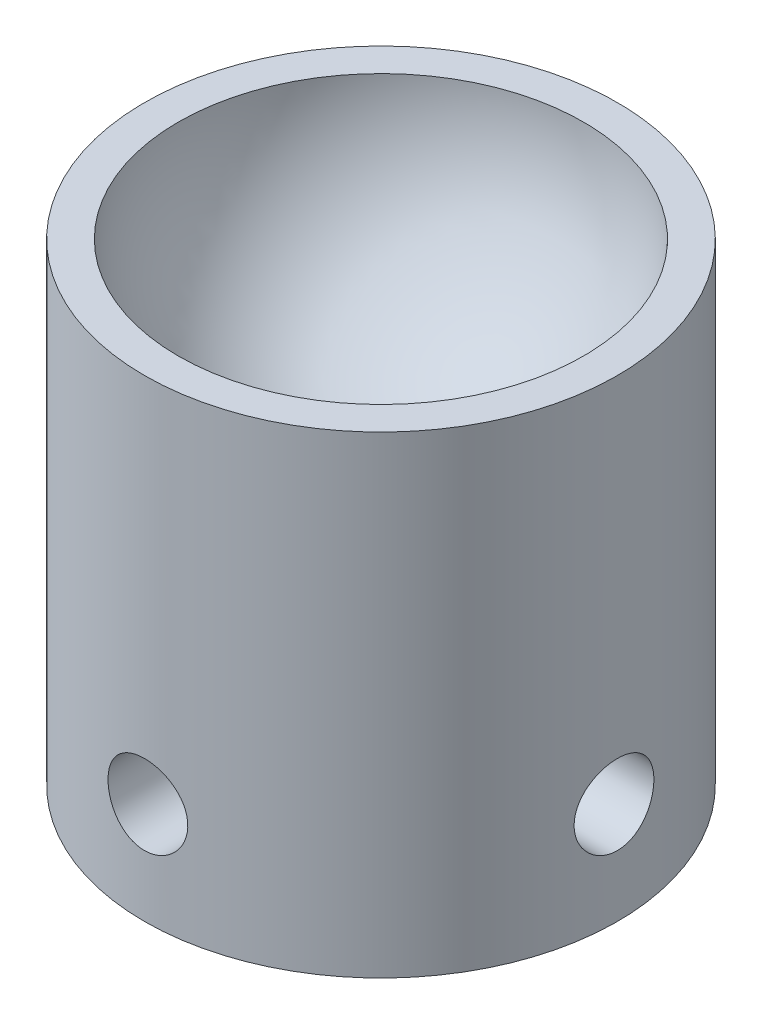
ISO-10303-21;
HEADER;
FILE_DESCRIPTION(('STEP AP214'),'2;1');
FILE_NAME('part.step','',(''),(''),'','','');
FILE_SCHEMA(('AUTOMOTIVE_DESIGN { 1 0 10303 214 1 1 1 1 }'));
ENDSEC;
DATA;
#1=APPLICATION_CONTEXT('core data for automotive mechanical design processes');
#2=APPLICATION_PROTOCOL_DEFINITION('international standard','automotive_design',2000,#1);
#3=PRODUCT_CONTEXT('',#1,'mechanical');
#4=PRODUCT('Part','Part','',(#3));
#5=PRODUCT_RELATED_PRODUCT_CATEGORY('part','',(#4));
#6=PRODUCT_DEFINITION_FORMATION('','',#4);
#7=PRODUCT_DEFINITION_CONTEXT('part definition',#1,'design');
#8=PRODUCT_DEFINITION('design','',#6,#7);
#9=PRODUCT_DEFINITION_SHAPE('','',#8);
#10=(LENGTH_UNIT() NAMED_UNIT(*) SI_UNIT(.MILLI.,.METRE.));
#11=(NAMED_UNIT(*) PLANE_ANGLE_UNIT() SI_UNIT($,.RADIAN.));
#12=(NAMED_UNIT(*) SI_UNIT($,.STERADIAN.) SOLID_ANGLE_UNIT());
#13=UNCERTAINTY_MEASURE_WITH_UNIT(LENGTH_MEASURE(1.E-05),#10,'distance_accuracy_value','');
#14=(GEOMETRIC_REPRESENTATION_CONTEXT(3) GLOBAL_UNCERTAINTY_ASSIGNED_CONTEXT((#13)) GLOBAL_UNIT_ASSIGNED_CONTEXT((#10,
#11,#12)) REPRESENTATION_CONTEXT('',''));
#15=CARTESIAN_POINT('',(0.,0.,0.));
#16=DIRECTION('',(0.,0.,1.));
#17=DIRECTION('',(1.,0.,0.));
#18=AXIS2_PLACEMENT_3D('',#15,#16,#17);
#19=CARTESIAN_POINT('',(0.,17.78,0.));
#20=DIRECTION('',(0.,-1.,0.));
#21=DIRECTION('',(0.,0.,-1.));
#22=AXIS2_PLACEMENT_3D('',#19,#20,#21);
#23=CYLINDRICAL_SURFACE('',#22,8.89);
#24=CARTESIAN_POINT('',(0.,17.78,0.));
#25=DIRECTION('',(0.,1.,0.));
#26=DIRECTION('',(0.,0.,1.));
#27=AXIS2_PLACEMENT_3D('',#24,#25,#26);
#28=CIRCLE('',#27,8.89);
#29=CARTESIAN_POINT('',(0.,17.78,8.89));
#30=VERTEX_POINT('',#29);
#31=EDGE_CURVE('E106',#30,#30,#28,.T.);
#32=ORIENTED_EDGE('',*,*,#31,.F.);
#33=EDGE_LOOP('',(#32));
#34=FACE_BOUND('',#33,.T.);
#35=CARTESIAN_POINT('',(0.,0.,0.));
#36=DIRECTION('',(0.,1.,0.));
#37=DIRECTION('',(0.,0.,1.));
#38=AXIS2_PLACEMENT_3D('',#35,#36,#37);
#39=CIRCLE('',#38,8.89);
#40=CARTESIAN_POINT('',(0.,0.,8.89));
#41=VERTEX_POINT('',#40);
#42=EDGE_CURVE('E109',#41,#41,#39,.T.);
#43=ORIENTED_EDGE('',*,*,#42,.T.);
#44=EDGE_LOOP('',(#43));
#45=FACE_BOUND('',#44,.T.);
#46=CARTESIAN_POINT('',(0.,5.31,-8.89));
#47=CARTESIAN_POINT('',(0.083619244032744,5.309996660814,-8.88999855737428));
#48=CARTESIAN_POINT('',(0.167283743570266,5.30298420109848,-8.88880793860139));
#49=CARTESIAN_POINT('',(0.332265171174126,5.27513190542198,-8.88417298508674));
#50=CARTESIAN_POINT('',(0.413579886449196,5.25427945246782,-8.88072659394836));
#51=CARTESIAN_POINT('',(0.571451022503896,5.19939556703437,-8.87196655693298));
#52=CARTESIAN_POINT('',(0.64801131349816,5.16537502131018,-8.86665445387327));
#53=CARTESIAN_POINT('',(0.794327496441052,5.085149404927,-8.85474669715955));
#54=CARTESIAN_POINT('',(0.864084143844678,5.03894568916334,-8.84815118625522));
#55=CARTESIAN_POINT('',(0.995505184062018,4.9351843108722,-8.83433528998376));
#56=CARTESIAN_POINT('',(1.05709332372455,4.87753071969983,-8.8271099361815));
#57=CARTESIAN_POINT('',(1.16977031476655,4.75271263264269,-8.8128866154523));
#58=CARTESIAN_POINT('',(1.22085849516851,4.68554752940795,-8.805888663081));
#59=CARTESIAN_POINT('',(1.31139204077857,4.54308775979755,-8.79286434398706));
#60=CARTESIAN_POINT('',(1.35076179862173,4.4677444066863,-8.78684439583679));
#61=CARTESIAN_POINT('',(1.41625739067095,4.31139527698634,-8.776526716091));
#62=CARTESIAN_POINT('',(1.4423841423903,4.2303898931219,-8.77222886518799));
#63=CARTESIAN_POINT('',(1.48041140584547,4.06582517931028,-8.76589150572812));
#64=CARTESIAN_POINT('',(1.4924436910227,3.98229711962522,-8.7638310921753));
#65=CARTESIAN_POINT('',(1.50234907598311,3.81438418338856,-8.76213867564258));
#66=CARTESIAN_POINT('',(1.50022320273959,3.72999936942564,-8.76250649652874));
#67=CARTESIAN_POINT('',(1.48197990479015,3.56371027791512,-8.76560990836582));
#68=CARTESIAN_POINT('',(1.46601067813342,3.48178920551851,-8.7683204190731));
#69=CARTESIAN_POINT('',(1.42076663144816,3.32180601440081,-8.77576453216942));
#70=CARTESIAN_POINT('',(1.39149134471982,3.24374403114078,-8.78049820551898));
#71=CARTESIAN_POINT('',(1.32031644649172,3.09325219840059,-8.79148228814132));
#72=CARTESIAN_POINT('',(1.27835545561975,3.02085193634523,-8.79774004235042));
#73=CARTESIAN_POINT('',(1.18304383024955,2.88406393868544,-8.81106211903501));
#74=CARTESIAN_POINT('',(1.12969225412714,2.8196768662034,-8.81812650817002));
#75=CARTESIAN_POINT('',(1.01230725012186,2.69988526818757,-8.83237599103691));
#76=CARTESIAN_POINT('',(0.948146706768969,2.64460527547387,-8.83956147791722));
#77=CARTESIAN_POINT('',(0.811394532355467,2.54557690670068,-8.85316060293243));
#78=CARTESIAN_POINT('',(0.73880284443681,2.50182860841528,-8.8595742358615));
#79=CARTESIAN_POINT('',(0.587130697781295,2.42709349497462,-8.870916457678));
#80=CARTESIAN_POINT('',(0.508044624643937,2.39611786408165,-8.8758437440515));
#81=CARTESIAN_POINT('',(0.345690856821238,2.34792390813881,-8.88364768250388));
#82=CARTESIAN_POINT('',(0.262423521421593,2.33070440320118,-8.886524510452));
#83=CARTESIAN_POINT('',(0.0951440549776342,2.31068074124361,-8.8898796947842));
#84=CARTESIAN_POINT('',(0.0111529347669649,2.30770565747931,-8.89038648879863));
#85=CARTESIAN_POINT('',(-0.156127544604831,2.31579932958637,-8.88902245420448));
#86=CARTESIAN_POINT('',(-0.239416931332953,2.32686753116546,-8.8871517194376));
#87=CARTESIAN_POINT('',(-0.402400369277261,2.36259142485057,-8.88126044230778));
#88=CARTESIAN_POINT('',(-0.482113534253656,2.38716231873531,-8.87725332129598));
#89=CARTESIAN_POINT('',(-0.636289133977939,2.4491035934227,-8.8675367725212));
#90=CARTESIAN_POINT('',(-0.710751267506555,2.48647470777596,-8.86182724719984));
#91=CARTESIAN_POINT('',(-0.853052327826102,2.57334582984733,-8.84926867727024));
#92=CARTESIAN_POINT('',(-0.920825322959676,2.62295238950411,-8.84240980154875));
#93=CARTESIAN_POINT('',(-1.047145872048,2.73273990707588,-8.82834257007869));
#94=CARTESIAN_POINT('',(-1.1056927375376,2.79292165341625,-8.82113418830197));
#95=CARTESIAN_POINT('',(-1.21253418915256,2.92291850843172,-8.80708819525932));
#96=CARTESIAN_POINT('',(-1.26071317647472,2.99282922045797,-8.80025533987522));
#97=CARTESIAN_POINT('',(-1.34464340060142,3.1398520153437,-8.7878234953174));
#98=CARTESIAN_POINT('',(-1.38039503840013,3.21696386574166,-8.78222446633384));
#99=CARTESIAN_POINT('',(-1.43828365517868,3.37587959489646,-8.77293005839471));
#100=CARTESIAN_POINT('',(-1.46047774375017,3.457662182658,-8.76922670497139));
#101=CARTESIAN_POINT('',(-1.49080065625236,3.62386237135786,-8.76412311254959));
#102=CARTESIAN_POINT('',(-1.49893073648699,3.70827973625202,-8.7627226678384));
#103=CARTESIAN_POINT('',(-1.50085914849675,3.87619852435982,-8.76239247215645));
#104=CARTESIAN_POINT('',(-1.49483947158132,3.95969785152656,-8.76343134696592));
#105=CARTESIAN_POINT('',(-1.46903323284326,4.12447732227122,-8.76779389847881));
#106=CARTESIAN_POINT('',(-1.44924671887362,4.20575747356188,-8.77111756724038));
#107=CARTESIAN_POINT('',(-1.39653887064636,4.36371837482701,-8.77966316734885));
#108=CARTESIAN_POINT('',(-1.36363358724359,4.44040461406675,-8.78488277831329));
#109=CARTESIAN_POINT('',(-1.28564106040869,4.58719754614013,-8.79663433056243));
#110=CARTESIAN_POINT('',(-1.24055318815746,4.65730389909322,-8.80316633958368));
#111=CARTESIAN_POINT('',(-1.13882742811584,4.78986574325301,-8.81690596700675));
#112=CARTESIAN_POINT('',(-1.08205578264398,4.85221785475052,-8.82412083379442));
#113=CARTESIAN_POINT('',(-0.958855792369681,4.9665727089643,-8.83835577452218));
#114=CARTESIAN_POINT('',(-0.892425223562485,5.01857306159704,-8.84537580315548));
#115=CARTESIAN_POINT('',(-0.751232350694191,5.11108630927995,-8.85848789847051));
#116=CARTESIAN_POINT('',(-0.676414271019465,5.15151507324093,-8.8645730270461));
#117=CARTESIAN_POINT('',(-0.520975819888329,5.21916793136975,-8.87506217271175));
#118=CARTESIAN_POINT('',(-0.4403612879639,5.24640510691241,-8.87946785429012));
#119=CARTESIAN_POINT('',(-0.299533614201586,5.28102536514075,-8.8851461806493));
#120=CARTESIAN_POINT('',(-0.240169889187229,5.29187334363987,-8.88695658268774));
#121=CARTESIAN_POINT('',(-0.120545272625734,5.30636180020692,-8.8893840017));
#122=CARTESIAN_POINT('',(-0.0602843971649691,5.31000240735033,-8.89000104004554));
#123=CARTESIAN_POINT('',(0.,5.31,-8.89));
#124=B_SPLINE_CURVE_WITH_KNOTS('',3,(#46,#47,#48,#49,#50,#51,#52,#53,#54,#55,#56,#57,#58,#59,
#60,#61,#62,#63,#64,#65,#66,#67,#68,#69,#70,#71,#72,#73,#74,#75,#76,#77,#78,#79,#80,#81,#82,#83,
#84,#85,#86,#87,#88,#89,#90,#91,#92,#93,#94,#95,#96,#97,#98,#99,#100,#101,#102,#103,#104,#105,
#106,#107,#108,#109,#110,#111,#112,#113,#114,#115,#116,#117,#118,#119,#120,#121,#122,#123),
.UNSPECIFIED.,.T.,.F.,(4,2,2,2,2,2,2,2,2,2,2,2,2,2,2,2,2,2,2,2,2,2,2,2,2,2,2,2,2,2,2,2,2,2,2,2,
2,2,4),(0.,0.250637365237149,0.501503534158908,0.752162740308566,1.00279408229381,
1.25562127889169,1.50846462685281,1.76290561943946,2.01732898121687,2.26935418077738,
2.52136109968829,2.7707030516303,3.02005374972436,3.2706307750932,3.52122852290988,
3.77501050194396,4.02879419253529,4.28279963685146,4.53678329232225,4.78771148575765,
5.03862977529751,5.28798998895488,5.53736449525282,5.78899249292869,6.04063925851329,
6.29496106115612,6.54927465681731,6.80250946291639,7.05572164699313,7.30569492097127,
7.55566732605638,7.8053348231359,8.05501520956846,8.30773114672437,8.56050536512957,
8.81507322194132,9.06938811825433,9.25008567473258,9.43077999510244),.UNSPECIFIED.);
#125=CARTESIAN_POINT('',(0.,5.31,-8.89));
#126=VERTEX_POINT('',#125);
#127=EDGE_CURVE('E72',#126,#126,#124,.T.);
#128=ORIENTED_EDGE('',*,*,#127,.F.);
#129=EDGE_LOOP('',(#128));
#130=FACE_BOUND('',#129,.T.);
#131=CARTESIAN_POINT('',(0.,2.31,8.89));
#132=CARTESIAN_POINT('',(0.083619244032744,2.310003339186,8.88999855737428));
#133=CARTESIAN_POINT('',(0.167283743570266,2.31701579890152,8.88880793860139));
#134=CARTESIAN_POINT('',(0.332265171174126,2.34486809457802,8.88417298508674));
#135=CARTESIAN_POINT('',(0.413579886449196,2.36572054753218,8.88072659394836));
#136=CARTESIAN_POINT('',(0.571451022503896,2.42060443296563,8.87196655693298));
#137=CARTESIAN_POINT('',(0.64801131349816,2.45462497868982,8.86665445387327));
#138=CARTESIAN_POINT('',(0.794327496441052,2.534850595073,8.85474669715955));
#139=CARTESIAN_POINT('',(0.864084143844678,2.58105431083666,8.84815118625522));
#140=CARTESIAN_POINT('',(0.995505184062018,2.6848156891278,8.83433528998376));
#141=CARTESIAN_POINT('',(1.05709332372455,2.74246928030017,8.8271099361815));
#142=CARTESIAN_POINT('',(1.16977031476655,2.86728736735731,8.8128866154523));
#143=CARTESIAN_POINT('',(1.22085849516851,2.93445247059205,8.805888663081));
#144=CARTESIAN_POINT('',(1.31139204077857,3.07691224020245,8.79286434398706));
#145=CARTESIAN_POINT('',(1.35076179862173,3.1522555933137,8.78684439583679));
#146=CARTESIAN_POINT('',(1.41625739067095,3.30860472301366,8.776526716091));
#147=CARTESIAN_POINT('',(1.4423841423903,3.3896101068781,8.77222886518799));
#148=CARTESIAN_POINT('',(1.48041140584547,3.55417482068972,8.76589150572812));
#149=CARTESIAN_POINT('',(1.4924436910227,3.63770288037478,8.7638310921753));
#150=CARTESIAN_POINT('',(1.50234907598311,3.80561581661144,8.76213867564258));
#151=CARTESIAN_POINT('',(1.50022320273959,3.89000063057436,8.76250649652874));
#152=CARTESIAN_POINT('',(1.48197990479015,4.05628972208488,8.76560990836582));
#153=CARTESIAN_POINT('',(1.46601067813342,4.13821079448149,8.7683204190731));
#154=CARTESIAN_POINT('',(1.42076663144816,4.29819398559919,8.77576453216942));
#155=CARTESIAN_POINT('',(1.39149134471982,4.37625596885922,8.78049820551898));
#156=CARTESIAN_POINT('',(1.32031644649172,4.52674780159941,8.79148228814132));
#157=CARTESIAN_POINT('',(1.27835545561975,4.59914806365477,8.79774004235042));
#158=CARTESIAN_POINT('',(1.18304383024955,4.73593606131455,8.81106211903501));
#159=CARTESIAN_POINT('',(1.12969225412714,4.80032313379659,8.81812650817002));
#160=CARTESIAN_POINT('',(1.01230725012186,4.92011473181243,8.83237599103691));
#161=CARTESIAN_POINT('',(0.948146706768968,4.97539472452613,8.83956147791722));
#162=CARTESIAN_POINT('',(0.811394532355466,5.07442309329932,8.85316060293243));
#163=CARTESIAN_POINT('',(0.738802844436809,5.11817139158472,8.8595742358615));
#164=CARTESIAN_POINT('',(0.587130697781294,5.19290650502538,8.870916457678));
#165=CARTESIAN_POINT('',(0.508044624643935,5.22388213591834,8.8758437440515));
#166=CARTESIAN_POINT('',(0.345690856821237,5.27207609186119,8.88364768250388));
#167=CARTESIAN_POINT('',(0.262423521421592,5.28929559679882,8.886524510452));
#168=CARTESIAN_POINT('',(0.0951440549776333,5.30931925875639,8.8898796947842));
#169=CARTESIAN_POINT('',(0.0111529347669643,5.31229434252069,8.89038648879863));
#170=CARTESIAN_POINT('',(-0.156127544604832,5.30420067041363,8.88902245420448));
#171=CARTESIAN_POINT('',(-0.239416931332954,5.29313246883454,8.8871517194376));
#172=CARTESIAN_POINT('',(-0.402400369277262,5.25740857514942,8.88126044230778));
#173=CARTESIAN_POINT('',(-0.482113534253657,5.23283768126469,8.87725332129598));
#174=CARTESIAN_POINT('',(-0.63628913397794,5.1708964065773,8.8675367725212));
#175=CARTESIAN_POINT('',(-0.710751267506555,5.13352529222404,8.86182724719984));
#176=CARTESIAN_POINT('',(-0.853052327826103,5.04665417015267,8.84926867727024));
#177=CARTESIAN_POINT('',(-0.920825322959677,4.99704761049589,8.84240980154875));
#178=CARTESIAN_POINT('',(-1.047145872048,4.88726009292412,8.82834257007869));
#179=CARTESIAN_POINT('',(-1.1056927375376,4.82707834658375,8.82113418830197));
#180=CARTESIAN_POINT('',(-1.21253418915256,4.69708149156828,8.80708819525932));
#181=CARTESIAN_POINT('',(-1.26071317647472,4.62717077954203,8.80025533987522));
#182=CARTESIAN_POINT('',(-1.34464340060142,4.4801479846563,8.7878234953174));
#183=CARTESIAN_POINT('',(-1.38039503840013,4.40303613425834,8.78222446633384));
#184=CARTESIAN_POINT('',(-1.43828365517868,4.24412040510353,8.77293005839471));
#185=CARTESIAN_POINT('',(-1.46047774375017,4.162337817342,8.76922670497139));
#186=CARTESIAN_POINT('',(-1.49080065625236,3.99613762864213,8.76412311254959));
#187=CARTESIAN_POINT('',(-1.49893073648699,3.91172026374798,8.7627226678384));
#188=CARTESIAN_POINT('',(-1.50085914849675,3.74380147564018,8.76239247215645));
#189=CARTESIAN_POINT('',(-1.49483947158132,3.66030214847344,8.76343134696592));
#190=CARTESIAN_POINT('',(-1.46903323284326,3.49552267772878,8.76779389847881));
#191=CARTESIAN_POINT('',(-1.44924671887362,3.41424252643811,8.77111756724038));
#192=CARTESIAN_POINT('',(-1.39653887064636,3.25628162517298,8.77966316734885));
#193=CARTESIAN_POINT('',(-1.36363358724359,3.17959538593324,8.78488277831329));
#194=CARTESIAN_POINT('',(-1.28564106040869,3.03280245385987,8.79663433056243));
#195=CARTESIAN_POINT('',(-1.24055318815746,2.96269610090678,8.80316633958368));
#196=CARTESIAN_POINT('',(-1.13882742811584,2.83013425674698,8.81690596700675));
#197=CARTESIAN_POINT('',(-1.08205578264398,2.76778214524948,8.82412083379442));
#198=CARTESIAN_POINT('',(-0.95885579236968,2.6534272910357,8.83835577452217));
#199=CARTESIAN_POINT('',(-0.892425223562484,2.60142693840296,8.84537580315548));
#200=CARTESIAN_POINT('',(-0.75123235069419,2.50891369072005,8.85848789847051));
#201=CARTESIAN_POINT('',(-0.676414271019465,2.46848492675907,8.8645730270461));
#202=CARTESIAN_POINT('',(-0.520975819888327,2.40083206863025,8.87506217271175));
#203=CARTESIAN_POINT('',(-0.440361287963898,2.37359489308759,8.87946785429012));
#204=CARTESIAN_POINT('',(-0.299533614201583,2.33897463485925,8.8851461806493));
#205=CARTESIAN_POINT('',(-0.240169889187227,2.32812665636013,8.88695658268774));
#206=CARTESIAN_POINT('',(-0.120545272625732,2.31363819979308,8.8893840017));
#207=CARTESIAN_POINT('',(-0.0602843971649684,2.30999759264967,8.89000104004554));
#208=CARTESIAN_POINT('',(0.,2.31,8.89));
#209=B_SPLINE_CURVE_WITH_KNOTS('',3,(#131,#132,#133,#134,#135,#136,#137,#138,#139,#140,#141,
#142,#143,#144,#145,#146,#147,#148,#149,#150,#151,#152,#153,#154,#155,#156,#157,#158,#159,#160,
#161,#162,#163,#164,#165,#166,#167,#168,#169,#170,#171,#172,#173,#174,#175,#176,#177,#178,#179,
#180,#181,#182,#183,#184,#185,#186,#187,#188,#189,#190,#191,#192,#193,#194,#195,#196,#197,#198,
#199,#200,#201,#202,#203,#204,#205,#206,#207,#208),.UNSPECIFIED.,.T.,.F.,(4,2,2,2,2,2,2,2,2,2,2,
2,2,2,2,2,2,2,2,2,2,2,2,2,2,2,2,2,2,2,2,2,2,2,2,2,2,2,4),(0.,0.250637365237149,
0.501503534158908,0.752162740308566,1.00279408229381,1.25562127889169,1.50846462685281,
1.76290561943946,2.01732898121687,2.26935418077738,2.52136109968829,2.7707030516303,
3.02005374972436,3.2706307750932,3.52122852290988,3.77501050194397,4.02879419253529,
4.28279963685146,4.53678329232225,4.78771148575765,5.03862977529752,5.28798998895488,
5.53736449525282,5.78899249292869,6.04063925851329,6.29496106115612,6.54927465681731,
6.80250946291639,7.05572164699313,7.30569492097127,7.55566732605638,7.8053348231359,
8.05501520956846,8.30773114672437,8.56050536512957,8.81507322194132,9.06938811825433,
9.25008567473259,9.43077999510244),.UNSPECIFIED.);
#210=CARTESIAN_POINT('',(0.,2.31,8.89));
#211=VERTEX_POINT('',#210);
#212=EDGE_CURVE('E61',#211,#211,#209,.T.);
#213=ORIENTED_EDGE('',*,*,#212,.F.);
#214=EDGE_LOOP('',(#213));
#215=FACE_BOUND('',#214,.T.);
#216=CARTESIAN_POINT('',(-8.76253958621585,3.81,1.50000000000003));
#217=CARTESIAN_POINT('',(-8.76254110814375,3.89360969319683,1.49999665288494));
#218=CARTESIAN_POINT('',(-8.76374922880061,3.97726466548432,1.49298574089361));
#219=CARTESIAN_POINT('',(-8.7684466196409,4.14222630502354,1.46514015034352));
#220=CARTESIAN_POINT('',(-8.77193797761299,4.22353075183866,1.44429281952491));
#221=CARTESIAN_POINT('',(-8.78079541331951,4.38138015409381,1.389423912146));
#222=CARTESIAN_POINT('',(-8.78615990708961,4.45792906669618,1.35541346397734));
#223=CARTESIAN_POINT('',(-8.79815729764527,4.60422611005744,1.27521164155399));
#224=CARTESIAN_POINT('',(-8.80479005581366,4.67397498278183,1.22902159828048));
#225=CARTESIAN_POINT('',(-8.81865147990661,4.80540449411356,1.12527416049658));
#226=CARTESIAN_POINT('',(-8.8258849911522,4.86700648894621,1.06761777201054));
#227=CARTESIAN_POINT('',(-8.84008986733127,4.97971030881225,0.942788232417712));
#228=CARTESIAN_POINT('',(-8.84706121655557,5.03081150543762,0.875614512163484));
#229=CARTESIAN_POINT('',(-8.86000762196231,5.12135890996226,0.733146887500411));
#230=CARTESIAN_POINT('',(-8.86597631606614,5.16073183384014,0.657805778839322));
#231=CARTESIAN_POINT('',(-8.87619095128358,5.22623389421637,0.501461515587887));
#232=CARTESIAN_POINT('',(-8.88043700717173,5.25236391308122,0.4204587386403));
#233=CARTESIAN_POINT('',(-8.88669374370733,5.29039763965059,0.25590325770099));
#234=CARTESIAN_POINT('',(-8.88872518144415,5.30243352883544,0.172381906951889));
#235=CARTESIAN_POINT('',(-8.89039513111004,5.31234844787451,0.0044821993766666));
#236=CARTESIAN_POINT('',(-8.89003380955657,5.3102284628675,-0.0798960974046248));
#237=CARTESIAN_POINT('',(-8.8869753634773,5.29199473491081,-0.246210490949315));
#238=CARTESIAN_POINT('',(-8.88430198536583,5.27602325174239,-0.328162683425669));
#239=CARTESIAN_POINT('',(-8.87694629959963,5.23076400040252,-0.488206939293394));
#240=CARTESIAN_POINT('',(-8.87226392957321,5.20147581879573,-0.566298882754527));
#241=CARTESIAN_POINT('',(-8.86137601309489,5.13027372529649,-0.71682798771712));
#242=CARTESIAN_POINT('',(-8.85516343992265,5.08830135970651,-0.789236970942451));
#243=CARTESIAN_POINT('',(-8.84190504668714,4.99296518754116,-0.926037637860004));
#244=CARTESIAN_POINT('',(-8.83485915756919,4.93960043661374,-0.990428656215908));
#245=CARTESIAN_POINT('',(-8.82061403044897,4.82220576672129,-1.11020630612653));
#246=CARTESIAN_POINT('',(-8.81341397500504,4.75805149892238,-1.16547103499943));
#247=CARTESIAN_POINT('',(-8.79975663761249,4.62131742888773,-1.26447155194708));
#248=CARTESIAN_POINT('',(-8.7932993628507,4.54873754514295,-1.30820722847688));
#249=CARTESIAN_POINT('',(-8.78185820833265,4.39706924352496,-1.38293311845478));
#250=CARTESIAN_POINT('',(-8.77687606014854,4.31797331487341,-1.4139083696756));
#251=CARTESIAN_POINT('',(-8.76897769670129,4.15559803135039,-1.46209857697369));
#252=CARTESIAN_POINT('',(-8.76606129471335,4.07231905531758,-1.47931477676305));
#253=CARTESIAN_POINT('',(-8.76266083573152,3.90503316875174,-1.49932592898661));
#254=CARTESIAN_POINT('',(-8.76214744970719,3.82104763782865,-1.50229478295273));
#255=CARTESIAN_POINT('',(-8.76353299611529,3.65377980793742,-1.4941906466022));
#256=CARTESIAN_POINT('',(-8.7654318329498,3.57049748123253,-1.48311821275076));
#257=CARTESIAN_POINT('',(-8.77140075544937,3.40755435853517,-1.447394172854));
#258=CARTESIAN_POINT('',(-8.77545664235743,3.32787353501272,-1.42283133307057));
#259=CARTESIAN_POINT('',(-8.78527072357323,3.17375907784781,-1.36091692916795));
#260=CARTESIAN_POINT('',(-8.79102902198802,3.09932576544963,-1.32356458291389));
#261=CARTESIAN_POINT('',(-8.80366713042889,2.95704599333324,-1.23672199059943));
#262=CARTESIAN_POINT('',(-8.81055701780792,2.88926837356176,-1.1871204526924));
#263=CARTESIAN_POINT('',(-8.82465261931009,2.76293617394409,-1.07733998133593));
#264=CARTESIAN_POINT('',(-8.83185835619418,2.70438226018417,-1.01716028465232));
#265=CARTESIAN_POINT('',(-8.8458666613675,2.59752320541143,-0.887160725089145));
#266=CARTESIAN_POINT('',(-8.85266410522912,2.54933413162533,-0.817244819221628));
#267=CARTESIAN_POINT('',(-8.8650073550978,2.46538623396843,-0.670208718405983));
#268=CARTESIAN_POINT('',(-8.87055320236301,2.42962700033423,-0.593088761053718));
#269=CARTESIAN_POINT('',(-8.87974614133868,2.37173383100332,-0.434176241748232));
#270=CARTESIAN_POINT('',(-8.88340163657626,2.34953951116275,-0.352406185287777));
#271=CARTESIAN_POINT('',(-8.88843755472988,2.31921189873835,-0.186232617310158));
#272=CARTESIAN_POINT('',(-8.88981816970778,2.31107741911812,-0.101829328722651));
#273=CARTESIAN_POINT('',(-8.89014595092829,2.30913522954919,0.0660952255936415));
#274=CARTESIAN_POINT('',(-8.88912309220509,2.31515104450862,0.149614444216717));
#275=CARTESIAN_POINT('',(-8.88482015010964,2.34095651804307,0.314434711842697));
#276=CARTESIAN_POINT('',(-8.88154008015183,2.36074609476165,0.395735774024957));
#277=CARTESIAN_POINT('',(-8.87309007244369,2.41346897527125,0.553742050820277));
#278=CARTESIAN_POINT('',(-8.86792234438886,2.44638691510068,0.63045251749016));
#279=CARTESIAN_POINT('',(-8.8562607028897,2.52441232043512,0.777288690853399));
#280=CARTESIAN_POINT('',(-8.84976672406125,2.56952038694851,0.847414072653339));
#281=CARTESIAN_POINT('',(-8.83607621584643,2.67126951692949,0.979977584527167));
#282=CARTESIAN_POINT('',(-8.82887233919204,2.72803965352866,1.04231589649788));
#283=CARTESIAN_POINT('',(-8.81462439750956,2.85123079708345,1.15664360890118));
#284=CARTESIAN_POINT('',(-8.80758037031065,2.91765406152263,1.20863058180742));
#285=CARTESIAN_POINT('',(-8.7943942901306,3.0588398899498,1.30112802533718));
#286=CARTESIAN_POINT('',(-8.78825916746231,3.13365957485068,1.341552306052));
#287=CARTESIAN_POINT('',(-8.77766756217707,3.28910116017919,1.40919634917542));
#288=CARTESIAN_POINT('',(-8.77320941219858,3.36971720194159,1.4364292351708));
#289=CARTESIAN_POINT('',(-8.7674597199051,3.5105336615143,1.47103846098768));
#290=CARTESIAN_POINT('',(-8.76562499346974,3.56988391340019,1.48188150376695));
#291=CARTESIAN_POINT('',(-8.76316438950576,3.68948161190054,1.496363411559));
#292=CARTESIAN_POINT('',(-8.76253848911754,3.74972904152712,1.50000241280442));
#293=CARTESIAN_POINT('',(-8.76253958621585,3.81,1.50000000000003));
#294=B_SPLINE_CURVE_WITH_KNOTS('',3,(#216,#217,#218,#219,#220,#221,#222,#223,#224,#225,#226,
#227,#228,#229,#230,#231,#232,#233,#234,#235,#236,#237,#238,#239,#240,#241,#242,#243,#244,#245,
#246,#247,#248,#249,#250,#251,#252,#253,#254,#255,#256,#257,#258,#259,#260,#261,#262,#263,#264,
#265,#266,#267,#268,#269,#270,#271,#272,#273,#274,#275,#276,#277,#278,#279,#280,#281,#282,#283,
#284,#285,#286,#287,#288,#289,#290,#291,#292,#293),.UNSPECIFIED.,.T.,.F.,(4,2,2,2,2,2,2,2,2,2,2,
2,2,2,2,2,2,2,2,2,2,2,2,2,2,2,2,2,2,2,2,2,2,2,2,2,2,2,4),(0.,0.250608664643722,0.50144680647914,
0.752073345783143,1.00267250806349,1.25553727342516,1.50841716677982,1.76284554016957,
2.01725695892637,2.26926277591087,2.52125105543283,2.77068156896894,3.02011982694944,
3.2707255925201,3.52135213969343,3.77509467024799,4.02883965570135,4.28288132855899,
4.53690003541135,4.78781019280886,5.03871040678708,5.28797915081855,5.53726314145939,
5.78890121625934,6.04055745468069,6.29489988336086,6.54923392656686,6.80242739652356,
7.05559948895807,7.30563092278586,7.55566087070805,7.80539906626871,8.05514957688895,
8.30782960441881,8.56056881915609,8.81514561482152,9.06946861945536,9.25012602272752,
9.43078000962981),.UNSPECIFIED.);
#295=CARTESIAN_POINT('',(-8.76253958621585,3.81,1.50000000000003));
#296=VERTEX_POINT('',#295);
#297=EDGE_CURVE('E118',#296,#296,#294,.T.);
#298=ORIENTED_EDGE('',*,*,#297,.F.);
#299=EDGE_LOOP('',(#298));
#300=FACE_BOUND('',#299,.T.);
#301=CARTESIAN_POINT('',(8.89000000000003,2.31,0.));
#302=CARTESIAN_POINT('',(8.88999855737431,2.310003339186,-0.0836192440327746));
#303=CARTESIAN_POINT('',(8.8888079386014,2.31701579890152,-0.167283743570296));
#304=CARTESIAN_POINT('',(8.88417298508673,2.34486809457802,-0.332265171174156));
#305=CARTESIAN_POINT('',(8.88072659394836,2.36572054753218,-0.413579886449226));
#306=CARTESIAN_POINT('',(8.87196655693299,2.42060443296563,-0.571451022503926));
#307=CARTESIAN_POINT('',(8.86665445387327,2.45462497868982,-0.64801131349819));
#308=CARTESIAN_POINT('',(8.85474669715955,2.534850595073,-0.794327496441082));
#309=CARTESIAN_POINT('',(8.84815118625522,2.58105431083666,-0.864084143844708));
#310=CARTESIAN_POINT('',(8.83433528998376,2.6848156891278,-0.995505184062048));
#311=CARTESIAN_POINT('',(8.8271099361815,2.74246928030017,-1.05709332372458));
#312=CARTESIAN_POINT('',(8.81288661545229,2.86728736735731,-1.16977031476658));
#313=CARTESIAN_POINT('',(8.80588866308099,2.93445247059204,-1.22085849516854));
#314=CARTESIAN_POINT('',(8.79286434398705,3.07691224020245,-1.3113920407786));
#315=CARTESIAN_POINT('',(8.78684439583678,3.1522555933137,-1.35076179862176));
#316=CARTESIAN_POINT('',(8.776526716091,3.30860472301365,-1.41625739067098));
#317=CARTESIAN_POINT('',(8.77222886518798,3.3896101068781,-1.44238414239033));
#318=CARTESIAN_POINT('',(8.76589150572811,3.55417482068971,-1.4804114058455));
#319=CARTESIAN_POINT('',(8.7638310921753,3.63770288037478,-1.49244369102273));
#320=CARTESIAN_POINT('',(8.76213867564258,3.80561581661144,-1.50234907598314));
#321=CARTESIAN_POINT('',(8.76250649652874,3.89000063057435,-1.50022320273962));
#322=CARTESIAN_POINT('',(8.76560990836581,4.05628972208488,-1.48197990479018));
#323=CARTESIAN_POINT('',(8.76832041907309,4.13821079448149,-1.46601067813345));
#324=CARTESIAN_POINT('',(8.77576453216941,4.29819398559919,-1.42076663144819));
#325=CARTESIAN_POINT('',(8.78049820551898,4.37625596885922,-1.39149134471985));
#326=CARTESIAN_POINT('',(8.79148228814132,4.52674780159941,-1.32031644649175));
#327=CARTESIAN_POINT('',(8.79774004235041,4.59914806365477,-1.27835545561978));
#328=CARTESIAN_POINT('',(8.811062119035,4.73593606131455,-1.18304383024958));
#329=CARTESIAN_POINT('',(8.81812650817002,4.80032313379659,-1.12969225412718));
#330=CARTESIAN_POINT('',(8.8323759910369,4.92011473181243,-1.0123072501219));
#331=CARTESIAN_POINT('',(8.83956147791722,4.97539472452613,-0.948146706769));
#332=CARTESIAN_POINT('',(8.85316060293243,5.07442309329932,-0.811394532355498));
#333=CARTESIAN_POINT('',(8.8595742358615,5.11817139158471,-0.738802844436842));
#334=CARTESIAN_POINT('',(8.870916457678,5.19290650502538,-0.587130697781327));
#335=CARTESIAN_POINT('',(8.8758437440515,5.22388213591834,-0.508044624643968));
#336=CARTESIAN_POINT('',(8.88364768250388,5.27207609186119,-0.34569085682127));
#337=CARTESIAN_POINT('',(8.886524510452,5.28929559679882,-0.262423521421625));
#338=CARTESIAN_POINT('',(8.8898796947842,5.30931925875639,-0.0951440549776663));
#339=CARTESIAN_POINT('',(8.89038648879863,5.31229434252069,-0.0111529347669974));
#340=CARTESIAN_POINT('',(8.88902245420448,5.30420067041363,0.156127544604799));
#341=CARTESIAN_POINT('',(8.8871517194376,5.29313246883454,0.239416931332921));
#342=CARTESIAN_POINT('',(8.88126044230778,5.25740857514942,0.402400369277229));
#343=CARTESIAN_POINT('',(8.87725332129598,5.23283768126469,0.482113534253624));
#344=CARTESIAN_POINT('',(8.8675367725212,5.1708964065773,0.636289133977907));
#345=CARTESIAN_POINT('',(8.86182724719985,5.13352529222404,0.710751267506523));
#346=CARTESIAN_POINT('',(8.84926867727024,5.04665417015267,0.853052327826071));
#347=CARTESIAN_POINT('',(8.84240980154875,4.99704761049589,0.920825322959645));
#348=CARTESIAN_POINT('',(8.82834257007869,4.88726009292412,1.04714587204797));
#349=CARTESIAN_POINT('',(8.82113418830197,4.82707834658375,1.10569273753757));
#350=CARTESIAN_POINT('',(8.80708819525932,4.69708149156828,1.21253418915252));
#351=CARTESIAN_POINT('',(8.80025533987522,4.62717077954203,1.26071317647469));
#352=CARTESIAN_POINT('',(8.7878234953174,4.4801479846563,1.34464340060139));
#353=CARTESIAN_POINT('',(8.78222446633385,4.40303613425834,1.3803950384001));
#354=CARTESIAN_POINT('',(8.77293005839472,4.24412040510354,1.43828365517865));
#355=CARTESIAN_POINT('',(8.76922670497139,4.162337817342,1.46047774375014));
#356=CARTESIAN_POINT('',(8.76412311254959,3.99613762864214,1.49080065625233));
#357=CARTESIAN_POINT('',(8.7627226678384,3.91172026374798,1.49893073648696));
#358=CARTESIAN_POINT('',(8.76239247215646,3.74380147564018,1.50085914849672));
#359=CARTESIAN_POINT('',(8.76343134696592,3.66030214847344,1.49483947158129));
#360=CARTESIAN_POINT('',(8.76779389847881,3.49552267772878,1.46903323284323));
#361=CARTESIAN_POINT('',(8.77111756724038,3.41424252643812,1.44924671887359));
#362=CARTESIAN_POINT('',(8.77966316734886,3.25628162517299,1.39653887064633));
#363=CARTESIAN_POINT('',(8.7848827783133,3.17959538593325,1.36363358724356));
#364=CARTESIAN_POINT('',(8.79663433056244,3.03280245385987,1.28564106040866));
#365=CARTESIAN_POINT('',(8.80316633958368,2.96269610090678,1.24055318815743));
#366=CARTESIAN_POINT('',(8.81690596700675,2.83013425674699,1.13882742811581));
#367=CARTESIAN_POINT('',(8.82412083379443,2.76778214524948,1.08205578264395));
#368=CARTESIAN_POINT('',(8.83835577452218,2.6534272910357,0.958855792369651));
#369=CARTESIAN_POINT('',(8.84537580315548,2.60142693840296,0.892425223562455));
#370=CARTESIAN_POINT('',(8.85848789847052,2.50891369072005,0.751232350694161));
#371=CARTESIAN_POINT('',(8.8645730270461,2.46848492675907,0.676414271019436));
#372=CARTESIAN_POINT('',(8.87506217271175,2.40083206863025,0.520975819888299));
#373=CARTESIAN_POINT('',(8.87946785429012,2.37359489308759,0.44036128796387));
#374=CARTESIAN_POINT('',(8.8851461806493,2.33897463485925,0.299533614201555));
#375=CARTESIAN_POINT('',(8.88695658268773,2.32812665636013,0.240169889187199));
#376=CARTESIAN_POINT('',(8.88938400170001,2.31363819979308,0.120545272625703));
#377=CARTESIAN_POINT('',(8.89000104004556,2.30999759264967,0.0602843971649382));
#378=CARTESIAN_POINT('',(8.89000000000003,2.31,0.));
#379=B_SPLINE_CURVE_WITH_KNOTS('',3,(#301,#302,#303,#304,#305,#306,#307,#308,#309,#310,#311,
#312,#313,#314,#315,#316,#317,#318,#319,#320,#321,#322,#323,#324,#325,#326,#327,#328,#329,#330,
#331,#332,#333,#334,#335,#336,#337,#338,#339,#340,#341,#342,#343,#344,#345,#346,#347,#348,#349,
#350,#351,#352,#353,#354,#355,#356,#357,#358,#359,#360,#361,#362,#363,#364,#365,#366,#367,#368,
#369,#370,#371,#372,#373,#374,#375,#376,#377,#378),.UNSPECIFIED.,.T.,.F.,(4,2,2,2,2,2,2,2,2,2,2,
2,2,2,2,2,2,2,2,2,2,2,2,2,2,2,2,2,2,2,2,2,2,2,2,2,2,2,4),(0.,0.250637365237148,
0.501503534158907,0.752162740308565,1.0027940822938,1.25562127889169,1.50846462685281,
1.76290561943946,2.01732898121687,2.26935418077738,2.52136109968828,2.7707030516303,
3.02005374972436,3.2706307750932,3.52122852290988,3.77501050194396,4.02879419253529,
4.28279963685146,4.53678329232225,4.78771148575765,5.03862977529751,5.28798998895488,
5.53736449525282,5.78899249292869,6.04063925851329,6.29496106115612,6.5492746568173,
6.80250946291639,7.05572164699313,7.30569492097127,7.55566732605638,7.8053348231359,
8.05501520956846,8.30773114672437,8.56050536512957,8.81507322194132,9.06938811825433,
9.25008567473258,9.43077999510244),.UNSPECIFIED.);
#380=CARTESIAN_POINT('',(8.89000000000003,2.31,0.));
#381=VERTEX_POINT('',#380);
#382=EDGE_CURVE('E121',#381,#381,#379,.T.);
#383=ORIENTED_EDGE('',*,*,#382,.F.);
#384=EDGE_LOOP('',(#383));
#385=FACE_BOUND('',#384,.T.);
#386=ADVANCED_FACE('F33',(#34,#45,#130,#215,#300,#385),#23,.T.);
#387=CARTESIAN_POINT('',(0.,3.81,8.89));
#388=DIRECTION('',(0.,0.,-1.));
#389=DIRECTION('',(-1.,0.,0.));
#390=AXIS2_PLACEMENT_3D('',#387,#388,#389);
#391=CYLINDRICAL_SURFACE('',#390,1.5);
#392=ORIENTED_EDGE('',*,*,#127,.T.);
#393=EDGE_LOOP('',(#392));
#394=FACE_BOUND('',#393,.T.);
#395=CARTESIAN_POINT('',(0.,3.81,0.));
#396=DIRECTION('',(0.707106781186546,0.,-0.707106781186549));
#397=DIRECTION('',(-0.707106781186549,0.,-0.707106781186546));
#398=AXIS2_PLACEMENT_3D('',#395,#396,#397);
#399=ELLIPSE('',#398,2.12132034355964,1.5);
#400=CARTESIAN_POINT('',(0.,5.31,0.));
#401=VERTEX_POINT('',#400);
#402=CARTESIAN_POINT('',(0.,2.31,0.));
#403=VERTEX_POINT('',#402);
#404=EDGE_CURVE('E46',#401,#403,#399,.F.);
#405=ORIENTED_EDGE('',*,*,#404,.T.);
#406=CARTESIAN_POINT('',(0.,3.81,0.));
#407=DIRECTION('',(-0.707106781186549,0.,-0.707106781186546));
#408=DIRECTION('',(0.707106781186546,0.,-0.707106781186549));
#409=AXIS2_PLACEMENT_3D('',#406,#407,#408);
#410=ELLIPSE('',#409,2.12132034355965,1.5);
#411=EDGE_CURVE('E11',#403,#401,#410,.F.);
#412=ORIENTED_EDGE('',*,*,#411,.T.);
#413=EDGE_LOOP('',(#405,#412));
#414=FACE_BOUND('',#413,.T.);
#415=ADVANCED_FACE('F63',(#394,#414),#391,.F.);
#416=ORIENTED_EDGE('',*,*,#212,.T.);
#417=EDGE_LOOP('',(#416));
#418=FACE_BOUND('',#417,.T.);
#419=CARTESIAN_POINT('',(0.,3.81,0.));
#420=DIRECTION('',(0.707106781186546,0.,-0.707106781186549));
#421=DIRECTION('',(-0.707106781186549,0.,-0.707106781186546));
#422=AXIS2_PLACEMENT_3D('',#419,#420,#421);
#423=ELLIPSE('',#422,2.12132034355964,1.5);
#424=EDGE_CURVE('E52',#401,#403,#423,.T.);
#425=ORIENTED_EDGE('',*,*,#424,.T.);
#426=CARTESIAN_POINT('',(0.,3.81,0.));
#427=DIRECTION('',(-0.707106781186549,0.,-0.707106781186546));
#428=DIRECTION('',(0.707106781186546,0.,-0.707106781186549));
#429=AXIS2_PLACEMENT_3D('',#426,#427,#428);
#430=ELLIPSE('',#429,2.12132034355965,1.5);
#431=EDGE_CURVE('E41',#403,#401,#430,.T.);
#432=ORIENTED_EDGE('',*,*,#431,.T.);
#433=EDGE_LOOP('',(#425,#432));
#434=FACE_BOUND('',#433,.T.);
#435=ADVANCED_FACE('F64',(#418,#434),#391,.F.);
#436=CARTESIAN_POINT('',(0.,17.78,0.));
#437=DIRECTION('',(0.,1.,0.));
#438=DIRECTION('',(0.,0.,1.));
#439=AXIS2_PLACEMENT_3D('',#436,#437,#438);
#440=PLANE('',#439);
#441=CARTESIAN_POINT('',(0.,17.78,0.));
#442=DIRECTION('',(0.,1.,0.));
#443=DIRECTION('',(0.,0.,1.));
#444=AXIS2_PLACEMENT_3D('',#441,#442,#443);
#445=CIRCLE('',#444,7.62);
#446=CARTESIAN_POINT('',(0.,17.78,7.62));
#447=VERTEX_POINT('',#446);
#448=EDGE_CURVE('E122',#447,#447,#445,.F.);
#449=ORIENTED_EDGE('',*,*,#448,.T.);
#450=EDGE_LOOP('',(#449));
#451=FACE_BOUND('',#450,.T.);
#452=ORIENTED_EDGE('',*,*,#31,.T.);
#453=EDGE_LOOP('',(#452));
#454=FACE_BOUND('',#453,.T.);
#455=ADVANCED_FACE('F89',(#451,#454),#440,.T.);
#456=CARTESIAN_POINT('',(0.,0.,0.));
#457=DIRECTION('',(0.,1.,0.));
#458=DIRECTION('',(0.,0.,1.));
#459=AXIS2_PLACEMENT_3D('',#456,#457,#458);
#460=PLANE('',#459);
#461=ORIENTED_EDGE('',*,*,#42,.F.);
#462=EDGE_LOOP('',(#461));
#463=FACE_BOUND('',#462,.T.);
#464=ADVANCED_FACE('F87',(#463),#460,.F.);
#465=CARTESIAN_POINT('',(0.,17.78,0.));
#466=DIRECTION('',(0.,-1.,0.));
#467=DIRECTION('',(-1.,0.,0.));
#468=AXIS2_PLACEMENT_3D('',#465,#466,#467);
#469=SPHERICAL_SURFACE('',#468,7.62);
#470=ORIENTED_EDGE('',*,*,#448,.F.);
#471=EDGE_LOOP('',(#470));
#472=FACE_BOUND('',#471,.T.);
#473=ADVANCED_FACE('F83',(#472),#469,.F.);
#474=CARTESIAN_POINT('',(8.89000000000003,3.81,0.));
#475=DIRECTION('',(-1.,0.,0.));
#476=DIRECTION('',(0.,0.,1.));
#477=AXIS2_PLACEMENT_3D('',#474,#475,#476);
#478=CYLINDRICAL_SURFACE('',#477,1.5);
#479=ORIENTED_EDGE('',*,*,#404,.F.);
#480=ORIENTED_EDGE('',*,*,#431,.F.);
#481=EDGE_LOOP('',(#479,#480));
#482=FACE_BOUND('',#481,.T.);
#483=ORIENTED_EDGE('',*,*,#297,.T.);
#484=EDGE_LOOP('',(#483));
#485=FACE_BOUND('',#484,.T.);
#486=ADVANCED_FACE('F59',(#482,#485),#478,.F.);
#487=ORIENTED_EDGE('',*,*,#424,.F.);
#488=ORIENTED_EDGE('',*,*,#411,.F.);
#489=EDGE_LOOP('',(#487,#488));
#490=FACE_BOUND('',#489,.T.);
#491=ORIENTED_EDGE('',*,*,#382,.T.);
#492=EDGE_LOOP('',(#491));
#493=FACE_BOUND('',#492,.T.);
#494=ADVANCED_FACE('F53',(#490,#493),#478,.F.);
#495=CLOSED_SHELL('',(#386,#415,#435,#455,#464,#473,#486,#494));
#496=MANIFOLD_SOLID_BREP('B2',#495);
#497=ADVANCED_BREP_SHAPE_REPRESENTATION('',(#18,#496),#14);
#498=SHAPE_DEFINITION_REPRESENTATION(#9,#497);
ENDSEC;
END-ISO-10303-21;
